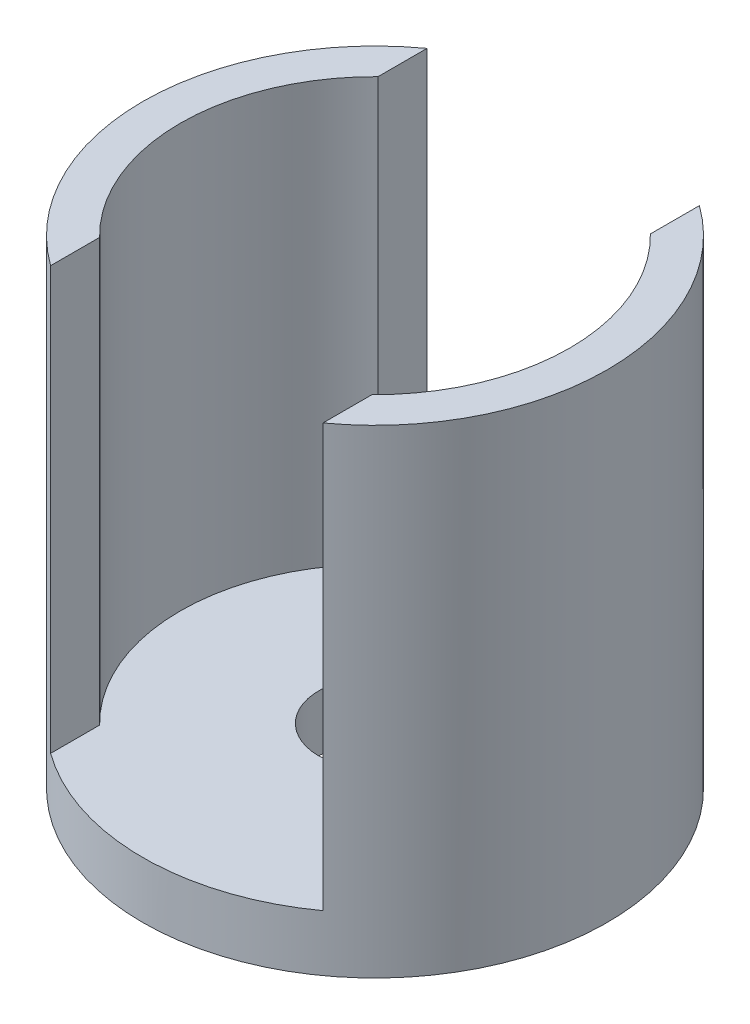
ISO-10303-21;
HEADER;
FILE_DESCRIPTION(('STEP AP214'),'2;1');
FILE_NAME('part.step','',(''),(''),'','','');
FILE_SCHEMA(('AUTOMOTIVE_DESIGN { 1 0 10303 214 1 1 1 1 }'));
ENDSEC;
DATA;
#1=APPLICATION_CONTEXT('core data for automotive mechanical design processes');
#2=APPLICATION_PROTOCOL_DEFINITION('international standard','automotive_design',2000,#1);
#3=PRODUCT_CONTEXT('',#1,'mechanical');
#4=PRODUCT('Part','Part','',(#3));
#5=PRODUCT_RELATED_PRODUCT_CATEGORY('part','',(#4));
#6=PRODUCT_DEFINITION_FORMATION('','',#4);
#7=PRODUCT_DEFINITION_CONTEXT('part definition',#1,'design');
#8=PRODUCT_DEFINITION('design','',#6,#7);
#9=PRODUCT_DEFINITION_SHAPE('','',#8);
#10=(LENGTH_UNIT() NAMED_UNIT(*) SI_UNIT(.MILLI.,.METRE.));
#11=(NAMED_UNIT(*) PLANE_ANGLE_UNIT() SI_UNIT($,.RADIAN.));
#12=(NAMED_UNIT(*) SI_UNIT($,.STERADIAN.) SOLID_ANGLE_UNIT());
#13=UNCERTAINTY_MEASURE_WITH_UNIT(LENGTH_MEASURE(1.E-05),#10,'distance_accuracy_value','');
#14=(GEOMETRIC_REPRESENTATION_CONTEXT(3) GLOBAL_UNCERTAINTY_ASSIGNED_CONTEXT((#13)) GLOBAL_UNIT_ASSIGNED_CONTEXT((#10,
#11,#12)) REPRESENTATION_CONTEXT('',''));
#15=CARTESIAN_POINT('',(0.,0.,0.));
#16=DIRECTION('',(0.,0.,1.));
#17=DIRECTION('',(1.,0.,0.));
#18=AXIS2_PLACEMENT_3D('',#15,#16,#17);
#19=CARTESIAN_POINT('',(0.,2.,0.));
#20=DIRECTION('',(0.,1.,0.));
#21=DIRECTION('',(0.,0.,1.));
#22=AXIS2_PLACEMENT_3D('',#19,#20,#21);
#23=PLANE('',#22);
#24=DIRECTION('',(0.,0.,-1.));
#25=VECTOR('',#24,1.);
#26=CARTESIAN_POINT('',(4.83682128080895,2.,0.));
#27=LINE('',#26,#25);
#28=CARTESIAN_POINT('',(4.83682128080895,2.,6.68338685828627));
#29=VERTEX_POINT('',#28);
#30=CARTESIAN_POINT('',(4.83682128080895,2.,4.94296011858461));
#31=VERTEX_POINT('',#30);
#32=EDGE_CURVE('E61',#29,#31,#27,.T.);
#33=ORIENTED_EDGE('',*,*,#32,.T.);
#34=CARTESIAN_POINT('',(0.,2.,0.));
#35=DIRECTION('',(0.,1.,0.));
#36=DIRECTION('',(0.,0.,1.));
#37=AXIS2_PLACEMENT_3D('',#34,#35,#36);
#38=CIRCLE('',#37,6.91575699662765);
#39=CARTESIAN_POINT('',(4.83682128080895,2.,-4.94296011858461));
#40=VERTEX_POINT('',#39);
#41=EDGE_CURVE('E66',#31,#40,#38,.T.);
#42=ORIENTED_EDGE('',*,*,#41,.T.);
#43=CARTESIAN_POINT('',(4.83682128080895,2.,-6.68338685828627));
#44=VERTEX_POINT('',#43);
#45=EDGE_CURVE('E128',#40,#44,#27,.T.);
#46=ORIENTED_EDGE('',*,*,#45,.T.);
#47=CARTESIAN_POINT('',(0.,2.,0.));
#48=DIRECTION('',(0.,1.,0.));
#49=DIRECTION('',(0.,0.,1.));
#50=AXIS2_PLACEMENT_3D('',#47,#48,#49);
#51=CIRCLE('',#50,8.25);
#52=CARTESIAN_POINT('',(-4.83682128080895,2.,-6.68338685828627));
#53=VERTEX_POINT('',#52);
#54=EDGE_CURVE('E55',#44,#53,#51,.T.);
#55=ORIENTED_EDGE('',*,*,#54,.T.);
#56=DIRECTION('',(0.,0.,-1.));
#57=VECTOR('',#56,1.);
#58=CARTESIAN_POINT('',(-4.83682128080895,2.,0.));
#59=LINE('',#58,#57);
#60=CARTESIAN_POINT('',(-4.83682128080895,2.,-4.94296011858461));
#61=VERTEX_POINT('',#60);
#62=EDGE_CURVE('E167',#61,#53,#59,.T.);
#63=ORIENTED_EDGE('',*,*,#62,.F.);
#64=CARTESIAN_POINT('',(0.,2.,0.));
#65=DIRECTION('',(0.,1.,0.));
#66=DIRECTION('',(0.,0.,1.));
#67=AXIS2_PLACEMENT_3D('',#64,#65,#66);
#68=CIRCLE('',#67,6.91575699662765);
#69=CARTESIAN_POINT('',(-4.83682128080895,2.,4.94296011858461));
#70=VERTEX_POINT('',#69);
#71=EDGE_CURVE('E118',#61,#70,#68,.T.);
#72=ORIENTED_EDGE('',*,*,#71,.T.);
#73=CARTESIAN_POINT('',(-4.83682128080895,2.,6.68338685828627));
#74=VERTEX_POINT('',#73);
#75=EDGE_CURVE('E158',#74,#70,#59,.T.);
#76=ORIENTED_EDGE('',*,*,#75,.F.);
#77=EDGE_CURVE('E11',#74,#29,#51,.T.);
#78=ORIENTED_EDGE('',*,*,#77,.T.);
#79=EDGE_LOOP('',(#33,#42,#46,#55,#63,#72,#76,#78));
#80=FACE_BOUND('',#79,.T.);
#81=CARTESIAN_POINT('',(0.,2.,0.));
#82=DIRECTION('',(0.,1.,0.));
#83=DIRECTION('',(0.,0.,1.));
#84=AXIS2_PLACEMENT_3D('',#81,#82,#83);
#85=CIRCLE('',#84,2.);
#86=CARTESIAN_POINT('',(0.,2.,2.));
#87=VERTEX_POINT('',#86);
#88=EDGE_CURVE('E188',#87,#87,#85,.T.);
#89=ORIENTED_EDGE('',*,*,#88,.F.);
#90=EDGE_LOOP('',(#89));
#91=FACE_BOUND('',#90,.T.);
#92=ADVANCED_FACE('F45',(#80,#91),#23,.T.);
#93=CARTESIAN_POINT('',(0.,0.,0.));
#94=DIRECTION('',(0.,1.,0.));
#95=DIRECTION('',(0.,0.,1.));
#96=AXIS2_PLACEMENT_3D('',#93,#94,#95);
#97=PLANE('',#96);
#98=CARTESIAN_POINT('',(0.,0.,0.));
#99=DIRECTION('',(0.,1.,0.));
#100=DIRECTION('',(0.,0.,1.));
#101=AXIS2_PLACEMENT_3D('',#98,#99,#100);
#102=CIRCLE('',#101,8.25);
#103=CARTESIAN_POINT('',(0.,0.,8.25));
#104=VERTEX_POINT('',#103);
#105=EDGE_CURVE('E49',#104,#104,#102,.T.);
#106=ORIENTED_EDGE('',*,*,#105,.F.);
#107=EDGE_LOOP('',(#106));
#108=FACE_BOUND('',#107,.T.);
#109=CARTESIAN_POINT('',(0.,0.,0.));
#110=DIRECTION('',(0.,1.,0.));
#111=DIRECTION('',(0.,0.,1.));
#112=AXIS2_PLACEMENT_3D('',#109,#110,#111);
#113=CIRCLE('',#112,2.);
#114=CARTESIAN_POINT('',(0.,0.,2.));
#115=VERTEX_POINT('',#114);
#116=EDGE_CURVE('E187',#115,#115,#113,.T.);
#117=ORIENTED_EDGE('',*,*,#116,.T.);
#118=EDGE_LOOP('',(#117));
#119=FACE_BOUND('',#118,.T.);
#120=ADVANCED_FACE('F196',(#108,#119),#97,.F.);
#121=CARTESIAN_POINT('',(0.,2.,0.));
#122=DIRECTION('',(0.,-1.,0.));
#123=DIRECTION('',(0.,0.,-1.));
#124=AXIS2_PLACEMENT_3D('',#121,#122,#123);
#125=CYLINDRICAL_SURFACE('',#124,8.25);
#126=ORIENTED_EDGE('',*,*,#77,.F.);
#127=DIRECTION('',(0.,-1.,0.));
#128=VECTOR('',#127,1.);
#129=CARTESIAN_POINT('',(-4.83682128080895,17.,6.68338685828627));
#130=LINE('',#129,#128);
#131=CARTESIAN_POINT('',(-4.83682128080895,17.,6.68338685828627));
#132=VERTEX_POINT('',#131);
#133=EDGE_CURVE('E175',#132,#74,#130,.T.);
#134=ORIENTED_EDGE('',*,*,#133,.F.);
#135=CARTESIAN_POINT('',(0.,17.,0.));
#136=DIRECTION('',(0.,1.,0.));
#137=DIRECTION('',(0.,0.,1.));
#138=AXIS2_PLACEMENT_3D('',#135,#136,#137);
#139=CIRCLE('',#138,8.25);
#140=CARTESIAN_POINT('',(-4.83682128080895,17.,-6.68338685828627));
#141=VERTEX_POINT('',#140);
#142=EDGE_CURVE('E161',#141,#132,#139,.T.);
#143=ORIENTED_EDGE('',*,*,#142,.F.);
#144=DIRECTION('',(0.,-1.,0.));
#145=VECTOR('',#144,1.);
#146=CARTESIAN_POINT('',(-4.83682128080895,17.,-6.68338685828627));
#147=LINE('',#146,#145);
#148=EDGE_CURVE('E179',#141,#53,#147,.T.);
#149=ORIENTED_EDGE('',*,*,#148,.T.);
#150=ORIENTED_EDGE('',*,*,#54,.F.);
#151=DIRECTION('',(0.,-1.,0.));
#152=VECTOR('',#151,1.);
#153=CARTESIAN_POINT('',(4.83682128080895,17.,-6.68338685828627));
#154=LINE('',#153,#152);
#155=CARTESIAN_POINT('',(4.83682128080895,17.,-6.68338685828627));
#156=VERTEX_POINT('',#155);
#157=EDGE_CURVE('E143',#156,#44,#154,.T.);
#158=ORIENTED_EDGE('',*,*,#157,.F.);
#159=CARTESIAN_POINT('',(0.,17.,0.));
#160=DIRECTION('',(0.,1.,0.));
#161=DIRECTION('',(0.,0.,1.));
#162=AXIS2_PLACEMENT_3D('',#159,#160,#161);
#163=CIRCLE('',#162,8.25);
#164=CARTESIAN_POINT('',(4.83682128080895,17.,6.68338685828627));
#165=VERTEX_POINT('',#164);
#166=EDGE_CURVE('E134',#165,#156,#163,.T.);
#167=ORIENTED_EDGE('',*,*,#166,.F.);
#168=DIRECTION('',(0.,-1.,0.));
#169=VECTOR('',#168,1.);
#170=CARTESIAN_POINT('',(4.83682128080895,17.,6.68338685828627));
#171=LINE('',#170,#169);
#172=EDGE_CURVE('E119',#165,#29,#171,.T.);
#173=ORIENTED_EDGE('',*,*,#172,.T.);
#174=EDGE_LOOP('',(#126,#134,#143,#149,#150,#158,#167,#173));
#175=FACE_BOUND('',#174,.T.);
#176=ORIENTED_EDGE('',*,*,#105,.T.);
#177=EDGE_LOOP('',(#176));
#178=FACE_BOUND('',#177,.T.);
#179=ADVANCED_FACE('F47',(#175,#178),#125,.T.);
#180=CARTESIAN_POINT('',(0.,2.,0.));
#181=DIRECTION('',(0.,-1.,0.));
#182=DIRECTION('',(0.,0.,-1.));
#183=AXIS2_PLACEMENT_3D('',#180,#181,#182);
#184=CYLINDRICAL_SURFACE('',#183,2.);
#185=ORIENTED_EDGE('',*,*,#88,.T.);
#186=EDGE_LOOP('',(#185));
#187=FACE_BOUND('',#186,.T.);
#188=ORIENTED_EDGE('',*,*,#116,.F.);
#189=EDGE_LOOP('',(#188));
#190=FACE_BOUND('',#189,.T.);
#191=ADVANCED_FACE('F198',(#187,#190),#184,.F.);
#192=CARTESIAN_POINT('',(0.,17.,0.));
#193=DIRECTION('',(0.,-1.,0.));
#194=DIRECTION('',(0.,0.,-1.));
#195=AXIS2_PLACEMENT_3D('',#192,#193,#194);
#196=CYLINDRICAL_SURFACE('',#195,6.91575699662765);
#197=ORIENTED_EDGE('',*,*,#71,.F.);
#198=DIRECTION('',(0.,-1.,0.));
#199=VECTOR('',#198,1.);
#200=CARTESIAN_POINT('',(-4.83682128080895,17.,-4.94296011858461));
#201=LINE('',#200,#199);
#202=CARTESIAN_POINT('',(-4.83682128080895,17.,-4.94296011858461));
#203=VERTEX_POINT('',#202);
#204=EDGE_CURVE('E183',#203,#61,#201,.T.);
#205=ORIENTED_EDGE('',*,*,#204,.F.);
#206=CARTESIAN_POINT('',(0.,17.,0.));
#207=DIRECTION('',(0.,1.,0.));
#208=DIRECTION('',(0.,0.,1.));
#209=AXIS2_PLACEMENT_3D('',#206,#207,#208);
#210=CIRCLE('',#209,6.91575699662765);
#211=CARTESIAN_POINT('',(-4.83682128080895,17.,4.94296011858461));
#212=VERTEX_POINT('',#211);
#213=EDGE_CURVE('E153',#203,#212,#210,.T.);
#214=ORIENTED_EDGE('',*,*,#213,.T.);
#215=DIRECTION('',(0.,-1.,0.));
#216=VECTOR('',#215,1.);
#217=CARTESIAN_POINT('',(-4.83682128080895,17.,4.94296011858461));
#218=LINE('',#217,#216);
#219=EDGE_CURVE('E171',#212,#70,#218,.T.);
#220=ORIENTED_EDGE('',*,*,#219,.T.);
#221=EDGE_LOOP('',(#197,#205,#214,#220));
#222=FACE_BOUND('',#221,.T.);
#223=ADVANCED_FACE('F200',(#222),#196,.F.);
#224=CARTESIAN_POINT('',(-4.83682128080895,17.,0.));
#225=DIRECTION('',(-1.,0.,0.));
#226=DIRECTION('',(0.,0.,1.));
#227=AXIS2_PLACEMENT_3D('',#224,#225,#226);
#228=PLANE('',#227);
#229=ORIENTED_EDGE('',*,*,#62,.T.);
#230=ORIENTED_EDGE('',*,*,#148,.F.);
#231=DIRECTION('',(0.,0.,-1.));
#232=VECTOR('',#231,1.);
#233=CARTESIAN_POINT('',(-4.83682128080895,17.,0.));
#234=LINE('',#233,#232);
#235=EDGE_CURVE('E157',#203,#141,#234,.T.);
#236=ORIENTED_EDGE('',*,*,#235,.F.);
#237=ORIENTED_EDGE('',*,*,#204,.T.);
#238=EDGE_LOOP('',(#229,#230,#236,#237));
#239=FACE_BOUND('',#238,.T.);
#240=ADVANCED_FACE('F207',(#239),#228,.F.);
#241=ORIENTED_EDGE('',*,*,#75,.T.);
#242=ORIENTED_EDGE('',*,*,#219,.F.);
#243=EDGE_CURVE('E162',#132,#212,#234,.T.);
#244=ORIENTED_EDGE('',*,*,#243,.F.);
#245=ORIENTED_EDGE('',*,*,#133,.T.);
#246=EDGE_LOOP('',(#241,#242,#244,#245));
#247=FACE_BOUND('',#246,.T.);
#248=ADVANCED_FACE('F242',(#247),#228,.F.);
#249=CARTESIAN_POINT('',(0.,17.,0.));
#250=DIRECTION('',(0.,1.,0.));
#251=DIRECTION('',(0.,0.,1.));
#252=AXIS2_PLACEMENT_3D('',#249,#250,#251);
#253=PLANE('',#252);
#254=ORIENTED_EDGE('',*,*,#213,.F.);
#255=ORIENTED_EDGE('',*,*,#235,.T.);
#256=ORIENTED_EDGE('',*,*,#142,.T.);
#257=ORIENTED_EDGE('',*,*,#243,.T.);
#258=EDGE_LOOP('',(#254,#255,#256,#257));
#259=FACE_BOUND('',#258,.T.);
#260=ADVANCED_FACE('F237',(#259),#253,.T.);
#261=CARTESIAN_POINT('',(0.,17.,0.));
#262=DIRECTION('',(0.,-1.,0.));
#263=DIRECTION('',(0.,0.,-1.));
#264=AXIS2_PLACEMENT_3D('',#261,#262,#263);
#265=CYLINDRICAL_SURFACE('',#264,6.91575699662765);
#266=ORIENTED_EDGE('',*,*,#41,.F.);
#267=DIRECTION('',(0.,-1.,0.));
#268=VECTOR('',#267,1.);
#269=CARTESIAN_POINT('',(4.83682128080895,17.,4.94296011858461));
#270=LINE('',#269,#268);
#271=CARTESIAN_POINT('',(4.83682128080895,17.,4.94296011858461));
#272=VERTEX_POINT('',#271);
#273=EDGE_CURVE('E110',#272,#31,#270,.T.);
#274=ORIENTED_EDGE('',*,*,#273,.F.);
#275=CARTESIAN_POINT('',(0.,17.,0.));
#276=DIRECTION('',(0.,1.,0.));
#277=DIRECTION('',(0.,0.,1.));
#278=AXIS2_PLACEMENT_3D('',#275,#276,#277);
#279=CIRCLE('',#278,6.91575699662765);
#280=CARTESIAN_POINT('',(4.83682128080895,17.,-4.94296011858461));
#281=VERTEX_POINT('',#280);
#282=EDGE_CURVE('E113',#272,#281,#279,.T.);
#283=ORIENTED_EDGE('',*,*,#282,.T.);
#284=DIRECTION('',(0.,-1.,0.));
#285=VECTOR('',#284,1.);
#286=CARTESIAN_POINT('',(4.83682128080895,17.,-4.94296011858461));
#287=LINE('',#286,#285);
#288=EDGE_CURVE('E139',#281,#40,#287,.T.);
#289=ORIENTED_EDGE('',*,*,#288,.T.);
#290=EDGE_LOOP('',(#266,#274,#283,#289));
#291=FACE_BOUND('',#290,.T.);
#292=ADVANCED_FACE('F112',(#291),#265,.F.);
#293=CARTESIAN_POINT('',(4.83682128080895,17.,0.));
#294=DIRECTION('',(-1.,0.,0.));
#295=DIRECTION('',(0.,0.,1.));
#296=AXIS2_PLACEMENT_3D('',#293,#294,#295);
#297=PLANE('',#296);
#298=ORIENTED_EDGE('',*,*,#32,.F.);
#299=ORIENTED_EDGE('',*,*,#172,.F.);
#300=DIRECTION('',(0.,0.,-1.));
#301=VECTOR('',#300,1.);
#302=CARTESIAN_POINT('',(4.83682128080895,17.,0.));
#303=LINE('',#302,#301);
#304=EDGE_CURVE('E124',#165,#272,#303,.T.);
#305=ORIENTED_EDGE('',*,*,#304,.T.);
#306=ORIENTED_EDGE('',*,*,#273,.T.);
#307=EDGE_LOOP('',(#298,#299,#305,#306));
#308=FACE_BOUND('',#307,.T.);
#309=ADVANCED_FACE('F130',(#308),#297,.T.);
#310=ORIENTED_EDGE('',*,*,#45,.F.);
#311=ORIENTED_EDGE('',*,*,#288,.F.);
#312=EDGE_CURVE('E126',#281,#156,#303,.T.);
#313=ORIENTED_EDGE('',*,*,#312,.T.);
#314=ORIENTED_EDGE('',*,*,#157,.T.);
#315=EDGE_LOOP('',(#310,#311,#313,#314));
#316=FACE_BOUND('',#315,.T.);
#317=ADVANCED_FACE('F254',(#316),#297,.T.);
#318=CARTESIAN_POINT('',(0.,17.,0.));
#319=DIRECTION('',(0.,1.,0.));
#320=DIRECTION('',(0.,0.,1.));
#321=AXIS2_PLACEMENT_3D('',#318,#319,#320);
#322=PLANE('',#321);
#323=ORIENTED_EDGE('',*,*,#282,.F.);
#324=ORIENTED_EDGE('',*,*,#304,.F.);
#325=ORIENTED_EDGE('',*,*,#166,.T.);
#326=ORIENTED_EDGE('',*,*,#312,.F.);
#327=EDGE_LOOP('',(#323,#324,#325,#326));
#328=FACE_BOUND('',#327,.T.);
#329=ADVANCED_FACE('F123',(#328),#322,.T.);
#330=CLOSED_SHELL('',(#92,#120,#179,#191,#223,#240,#248,#260,#292,#309,#317,#329));
#331=MANIFOLD_SOLID_BREP('B2',#330);
#332=ADVANCED_BREP_SHAPE_REPRESENTATION('',(#18,#331),#14);
#333=SHAPE_DEFINITION_REPRESENTATION(#9,#332);
ENDSEC;
END-ISO-10303-21;
